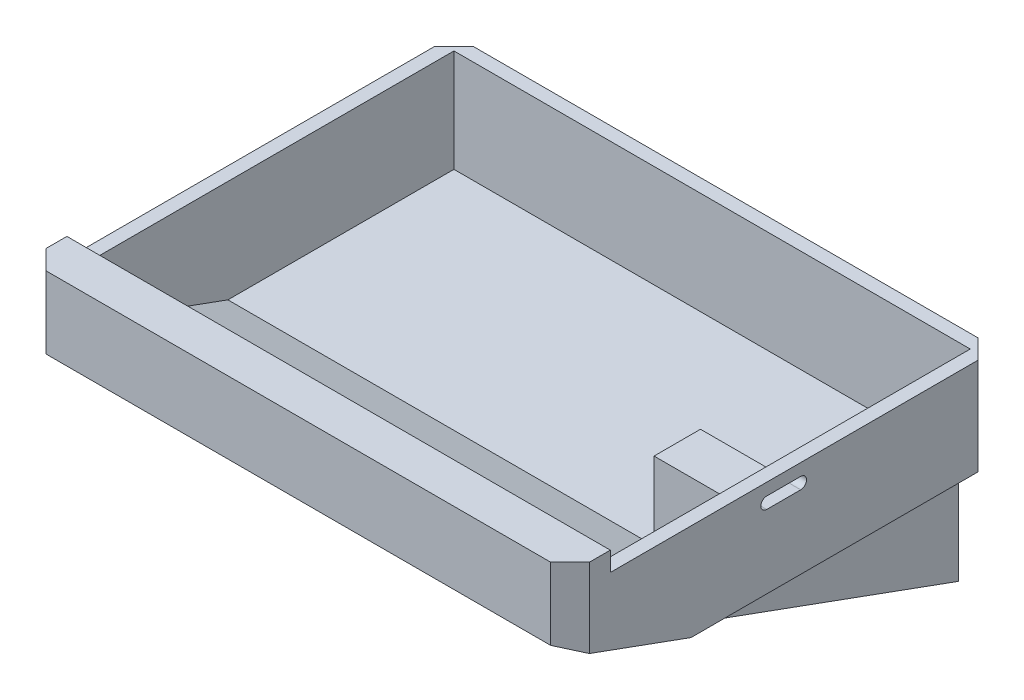
ISO-10303-21;
HEADER;
FILE_DESCRIPTION(('STEP AP214'),'2;1');
FILE_NAME('part.step','',(''),(''),'','','');
FILE_SCHEMA(('AUTOMOTIVE_DESIGN { 1 0 10303 214 1 1 1 1 }'));
ENDSEC;
DATA;
#1=APPLICATION_CONTEXT('core data for automotive mechanical design processes');
#2=APPLICATION_PROTOCOL_DEFINITION('international standard','automotive_design',2000,#1);
#3=PRODUCT_CONTEXT('',#1,'mechanical');
#4=PRODUCT('Part','Part','',(#3));
#5=PRODUCT_RELATED_PRODUCT_CATEGORY('part','',(#4));
#6=PRODUCT_DEFINITION_FORMATION('','',#4);
#7=PRODUCT_DEFINITION_CONTEXT('part definition',#1,'design');
#8=PRODUCT_DEFINITION('design','',#6,#7);
#9=PRODUCT_DEFINITION_SHAPE('','',#8);
#10=(LENGTH_UNIT() NAMED_UNIT(*) SI_UNIT(.MILLI.,.METRE.));
#11=(NAMED_UNIT(*) PLANE_ANGLE_UNIT() SI_UNIT($,.RADIAN.));
#12=(NAMED_UNIT(*) SI_UNIT($,.STERADIAN.) SOLID_ANGLE_UNIT());
#13=UNCERTAINTY_MEASURE_WITH_UNIT(LENGTH_MEASURE(1.E-05),#10,'distance_accuracy_value','');
#14=(GEOMETRIC_REPRESENTATION_CONTEXT(3) GLOBAL_UNCERTAINTY_ASSIGNED_CONTEXT((#13)) GLOBAL_UNIT_ASSIGNED_CONTEXT((#10,
#11,#12)) REPRESENTATION_CONTEXT('',''));
#15=CARTESIAN_POINT('',(0.,0.,0.));
#16=DIRECTION('',(0.,0.,1.));
#17=DIRECTION('',(1.,0.,0.));
#18=AXIS2_PLACEMENT_3D('',#15,#16,#17);
#19=CARTESIAN_POINT('',(0.,-30.,0.));
#20=DIRECTION('',(0.,-1.,0.));
#21=DIRECTION('',(0.,0.,-1.));
#22=AXIS2_PLACEMENT_3D('',#19,#20,#21);
#23=PLANE('',#22);
#24=DIRECTION('',(-1.,0.,0.));
#25=VECTOR('',#24,1.);
#26=CARTESIAN_POINT('',(0.,-30.,10.1999999999996));
#27=LINE('',#26,#25);
#28=CARTESIAN_POINT('',(60.2,-30.,10.1999999999996));
#29=VERTEX_POINT('',#28);
#30=CARTESIAN_POINT('',(-60.2,-30.,10.1999999999996));
#31=VERTEX_POINT('',#30);
#32=EDGE_CURVE('E66',#29,#31,#27,.T.);
#33=ORIENTED_EDGE('',*,*,#32,.T.);
#34=DIRECTION('',(0.,0.,1.));
#35=VECTOR('',#34,1.);
#36=CARTESIAN_POINT('',(-60.2,-30.,-50.2000000000001));
#37=LINE('',#36,#35);
#38=CARTESIAN_POINT('',(-60.2,-30.,-50.2000000000001));
#39=VERTEX_POINT('',#38);
#40=EDGE_CURVE('E262',#39,#31,#37,.T.);
#41=ORIENTED_EDGE('',*,*,#40,.F.);
#42=DIRECTION('',(1.,0.,0.));
#43=VECTOR('',#42,1.);
#44=CARTESIAN_POINT('',(0.,-30.,-50.2000000000001));
#45=LINE('',#44,#43);
#46=CARTESIAN_POINT('',(60.2,-30.,-50.2000000000001));
#47=VERTEX_POINT('',#46);
#48=EDGE_CURVE('E550',#39,#47,#45,.T.);
#49=ORIENTED_EDGE('',*,*,#48,.T.);
#50=DIRECTION('',(0.,0.,1.));
#51=VECTOR('',#50,1.);
#52=CARTESIAN_POINT('',(60.2,-30.,-50.2000000000001));
#53=LINE('',#52,#51);
#54=EDGE_CURVE('E295',#47,#29,#53,.T.);
#55=ORIENTED_EDGE('',*,*,#54,.T.);
#56=EDGE_LOOP('',(#33,#41,#49,#55));
#57=FACE_BOUND('',#56,.T.);
#58=ADVANCED_FACE('F47',(#57),#23,.T.);
#59=CARTESIAN_POINT('',(66.7,-30.,55.2));
#60=DIRECTION('',(1.,0.,0.));
#61=DIRECTION('',(0.,0.,-1.));
#62=AXIS2_PLACEMENT_3D('',#59,#60,#61);
#63=PLANE('',#62);
#64=DIRECTION('',(0.,0.,1.));
#65=VECTOR('',#64,1.);
#66=CARTESIAN_POINT('',(66.7,-6.1,-4.4));
#67=LINE('',#66,#65);
#68=CARTESIAN_POINT('',(66.7,-6.1,-4.4));
#69=VERTEX_POINT('',#68);
#70=CARTESIAN_POINT('',(66.7,-6.1,4.4));
#71=VERTEX_POINT('',#70);
#72=EDGE_CURVE('E358',#69,#71,#67,.T.);
#73=ORIENTED_EDGE('',*,*,#72,.F.);
#74=CARTESIAN_POINT('',(66.7,-4.6,-4.4));
#75=DIRECTION('',(-1.,0.,0.));
#76=DIRECTION('',(0.,0.,1.));
#77=AXIS2_PLACEMENT_3D('',#74,#75,#76);
#78=CIRCLE('',#77,1.5);
#79=CARTESIAN_POINT('',(66.7,-3.1,-4.4));
#80=VERTEX_POINT('',#79);
#81=EDGE_CURVE('E355',#80,#69,#78,.T.);
#82=ORIENTED_EDGE('',*,*,#81,.F.);
#83=DIRECTION('',(0.,0.,-1.));
#84=VECTOR('',#83,1.);
#85=CARTESIAN_POINT('',(66.7,-3.1,-4.4));
#86=LINE('',#85,#84);
#87=CARTESIAN_POINT('',(66.7,-3.1,4.4));
#88=VERTEX_POINT('',#87);
#89=EDGE_CURVE('E366',#88,#80,#86,.T.);
#90=ORIENTED_EDGE('',*,*,#89,.F.);
#91=CARTESIAN_POINT('',(66.7,-4.6,4.4));
#92=DIRECTION('',(-1.,0.,0.));
#93=DIRECTION('',(0.,0.,1.));
#94=AXIS2_PLACEMENT_3D('',#91,#92,#93);
#95=CIRCLE('',#94,1.5);
#96=EDGE_CURVE('E362',#71,#88,#95,.T.);
#97=ORIENTED_EDGE('',*,*,#96,.F.);
#98=EDGE_LOOP('',(#73,#82,#90,#97));
#99=FACE_BOUND('',#98,.T.);
#100=DIRECTION('',(0.,0.,-1.));
#101=VECTOR('',#100,1.);
#102=CARTESIAN_POINT('',(66.7,-26.5,55.2));
#103=LINE('',#102,#101);
#104=CARTESIAN_POINT('',(66.7,-26.5,6.70000000000046));
#105=VERTEX_POINT('',#104);
#106=CARTESIAN_POINT('',(66.7,-26.5,6.));
#107=VERTEX_POINT('',#106);
#108=EDGE_CURVE('E430',#105,#107,#103,.T.);
#109=ORIENTED_EDGE('',*,*,#108,.F.);
#110=DIRECTION('',(0.,-0.342020143325673,-0.939692620785907));
#111=VECTOR('',#110,1.);
#112=CARTESIAN_POINT('',(66.7,-26.5,6.70000000000046));
#113=LINE('',#112,#111);
#114=CARTESIAN_POINT('',(66.7,-10.1213394580209,51.7));
#115=VERTEX_POINT('',#114);
#116=EDGE_CURVE('E482',#105,#115,#113,.F.);
#117=ORIENTED_EDGE('',*,*,#116,.T.);
#118=DIRECTION('',(0.,1.,0.));
#119=VECTOR('',#118,1.);
#120=CARTESIAN_POINT('',(66.7,-30.,51.7));
#121=LINE('',#120,#119);
#122=CARTESIAN_POINT('',(66.7,0.,51.7));
#123=VERTEX_POINT('',#122);
#124=EDGE_CURVE('E425',#115,#123,#121,.T.);
#125=ORIENTED_EDGE('',*,*,#124,.T.);
#126=DIRECTION('',(0.,0.,-1.));
#127=VECTOR('',#126,1.);
#128=CARTESIAN_POINT('',(66.7,0.,55.2));
#129=LINE('',#128,#127);
#130=CARTESIAN_POINT('',(66.7,0.,44.8));
#131=VERTEX_POINT('',#130);
#132=EDGE_CURVE('E451',#123,#131,#129,.T.);
#133=ORIENTED_EDGE('',*,*,#132,.T.);
#134=CARTESIAN_POINT('',(66.7,0.,-51.7));
#135=VERTEX_POINT('',#134);
#136=EDGE_CURVE('E424',#131,#135,#129,.T.);
#137=ORIENTED_EDGE('',*,*,#136,.T.);
#138=DIRECTION('',(0.,1.,0.));
#139=VECTOR('',#138,1.);
#140=CARTESIAN_POINT('',(66.7,-30.,-51.7));
#141=LINE('',#140,#139);
#142=CARTESIAN_POINT('',(66.7,-26.5,-51.7));
#143=VERTEX_POINT('',#142);
#144=EDGE_CURVE('E435',#143,#135,#141,.T.);
#145=ORIENTED_EDGE('',*,*,#144,.F.);
#146=CARTESIAN_POINT('',(66.7,-26.5,-6.));
#147=VERTEX_POINT('',#146);
#148=EDGE_CURVE('E434',#147,#143,#103,.T.);
#149=ORIENTED_EDGE('',*,*,#148,.F.);
#150=DIRECTION('',(0.,-1.,0.));
#151=VECTOR('',#150,1.);
#152=CARTESIAN_POINT('',(66.7,-26.5,-6.));
#153=LINE('',#152,#151);
#154=CARTESIAN_POINT('',(66.7,-7.1,-6.));
#155=VERTEX_POINT('',#154);
#156=EDGE_CURVE('E330',#155,#147,#153,.T.);
#157=ORIENTED_EDGE('',*,*,#156,.F.);
#158=DIRECTION('',(0.,0.,-1.));
#159=VECTOR('',#158,1.);
#160=CARTESIAN_POINT('',(66.7,-7.1,-6.));
#161=LINE('',#160,#159);
#162=CARTESIAN_POINT('',(66.7,-7.1,6.));
#163=VERTEX_POINT('',#162);
#164=EDGE_CURVE('E319',#163,#155,#161,.T.);
#165=ORIENTED_EDGE('',*,*,#164,.F.);
#166=DIRECTION('',(0.,1.,0.));
#167=VECTOR('',#166,1.);
#168=CARTESIAN_POINT('',(66.7,-26.5,6.));
#169=LINE('',#168,#167);
#170=EDGE_CURVE('E334',#107,#163,#169,.T.);
#171=ORIENTED_EDGE('',*,*,#170,.F.);
#172=EDGE_LOOP('',(#109,#117,#125,#133,#137,#145,#149,#157,#165,#171));
#173=FACE_BOUND('',#172,.T.);
#174=ADVANCED_FACE('F685',(#99,#173),#63,.F.);
#175=CARTESIAN_POINT('',(0.,-26.5,0.));
#176=DIRECTION('',(0.,-1.,0.));
#177=DIRECTION('',(0.,0.,-1.));
#178=AXIS2_PLACEMENT_3D('',#175,#176,#177);
#179=PLANE('',#178);
#180=DIRECTION('',(0.,0.,1.));
#181=VECTOR('',#180,1.);
#182=CARTESIAN_POINT('',(-66.7,-26.5,55.2));
#183=LINE('',#182,#181);
#184=CARTESIAN_POINT('',(-66.7,-26.5,-51.7));
#185=VERTEX_POINT('',#184);
#186=CARTESIAN_POINT('',(-66.7,-26.5,6.70000000000046));
#187=VERTEX_POINT('',#186);
#188=EDGE_CURVE('E440',#185,#187,#183,.T.);
#189=ORIENTED_EDGE('',*,*,#188,.T.);
#190=DIRECTION('',(1.,0.,0.));
#191=VECTOR('',#190,1.);
#192=CARTESIAN_POINT('',(66.7,-26.5,6.70000000000046));
#193=LINE('',#192,#191);
#194=EDGE_CURVE('E478',#187,#105,#193,.T.);
#195=ORIENTED_EDGE('',*,*,#194,.T.);
#196=ORIENTED_EDGE('',*,*,#108,.T.);
#197=DIRECTION('',(1.,0.,0.));
#198=VECTOR('',#197,1.);
#199=CARTESIAN_POINT('',(42.7,-26.5,6.));
#200=LINE('',#199,#198);
#201=CARTESIAN_POINT('',(42.7,-26.5,6.));
#202=VERTEX_POINT('',#201);
#203=EDGE_CURVE('E348',#202,#107,#200,.T.);
#204=ORIENTED_EDGE('',*,*,#203,.F.);
#205=DIRECTION('',(0.,0.,1.));
#206=VECTOR('',#205,1.);
#207=CARTESIAN_POINT('',(42.7,-26.5,-6.));
#208=LINE('',#207,#206);
#209=CARTESIAN_POINT('',(42.7,-26.5,-6.));
#210=VERTEX_POINT('',#209);
#211=EDGE_CURVE('E318',#210,#202,#208,.T.);
#212=ORIENTED_EDGE('',*,*,#211,.F.);
#213=DIRECTION('',(1.,0.,0.));
#214=VECTOR('',#213,1.);
#215=CARTESIAN_POINT('',(42.7,-26.5,-6.));
#216=LINE('',#215,#214);
#217=EDGE_CURVE('E352',#210,#147,#216,.T.);
#218=ORIENTED_EDGE('',*,*,#217,.T.);
#219=ORIENTED_EDGE('',*,*,#148,.T.);
#220=DIRECTION('',(-1.,0.,0.));
#221=VECTOR('',#220,1.);
#222=CARTESIAN_POINT('',(-70.2,-26.5,-51.7));
#223=LINE('',#222,#221);
#224=EDGE_CURVE('E433',#143,#185,#223,.T.);
#225=ORIENTED_EDGE('',*,*,#224,.T.);
#226=EDGE_LOOP('',(#189,#195,#196,#204,#212,#218,#219,#225));
#227=FACE_BOUND('',#226,.T.);
#228=ADVANCED_FACE('F694',(#227),#179,.F.);
#229=CARTESIAN_POINT('',(0.,0.,0.));
#230=DIRECTION('',(0.,-1.,0.));
#231=DIRECTION('',(0.,0.,-1.));
#232=AXIS2_PLACEMENT_3D('',#229,#230,#231);
#233=PLANE('',#232);
#234=DIRECTION('',(-1.,0.,0.));
#235=VECTOR('',#234,1.);
#236=CARTESIAN_POINT('',(-70.2,0.,-55.2));
#237=LINE('',#236,#235);
#238=CARTESIAN_POINT('',(65.2,0.,-55.2));
#239=VERTEX_POINT('',#238);
#240=CARTESIAN_POINT('',(-65.2,0.,-55.2));
#241=VERTEX_POINT('',#240);
#242=EDGE_CURVE('E471',#239,#241,#237,.T.);
#243=ORIENTED_EDGE('',*,*,#242,.T.);
#244=DIRECTION('',(0.707106781186549,0.,-0.707106781186546));
#245=VECTOR('',#244,1.);
#246=CARTESIAN_POINT('',(-65.2,0.,-55.2));
#247=LINE('',#246,#245);
#248=CARTESIAN_POINT('',(-70.2,0.,-50.2));
#249=VERTEX_POINT('',#248);
#250=EDGE_CURVE('E11',#241,#249,#247,.F.);
#251=ORIENTED_EDGE('',*,*,#250,.T.);
#252=DIRECTION('',(0.,0.,1.));
#253=VECTOR('',#252,1.);
#254=CARTESIAN_POINT('',(-70.2,0.,55.2));
#255=LINE('',#254,#253);
#256=CARTESIAN_POINT('',(-70.2,0.,44.8));
#257=VERTEX_POINT('',#256);
#258=EDGE_CURVE('E475',#249,#257,#255,.T.);
#259=ORIENTED_EDGE('',*,*,#258,.T.);
#260=DIRECTION('',(-1.,0.,0.));
#261=VECTOR('',#260,1.);
#262=CARTESIAN_POINT('',(-70.2,0.,44.8));
#263=LINE('',#262,#261);
#264=CARTESIAN_POINT('',(-66.7,0.,44.8));
#265=VERTEX_POINT('',#264);
#266=EDGE_CURVE('E416',#265,#257,#263,.T.);
#267=ORIENTED_EDGE('',*,*,#266,.F.);
#268=DIRECTION('',(0.,0.,1.));
#269=VECTOR('',#268,1.);
#270=CARTESIAN_POINT('',(-66.7,0.,55.2));
#271=LINE('',#270,#269);
#272=CARTESIAN_POINT('',(-66.7,0.,-51.7));
#273=VERTEX_POINT('',#272);
#274=EDGE_CURVE('E460',#273,#265,#271,.T.);
#275=ORIENTED_EDGE('',*,*,#274,.F.);
#276=DIRECTION('',(-1.,0.,0.));
#277=VECTOR('',#276,1.);
#278=CARTESIAN_POINT('',(-70.2,0.,-51.7));
#279=LINE('',#278,#277);
#280=EDGE_CURVE('E455',#135,#273,#279,.T.);
#281=ORIENTED_EDGE('',*,*,#280,.F.);
#282=ORIENTED_EDGE('',*,*,#136,.F.);
#283=CARTESIAN_POINT('',(70.2,0.,44.8));
#284=VERTEX_POINT('',#283);
#285=EDGE_CURVE('E402',#284,#131,#263,.T.);
#286=ORIENTED_EDGE('',*,*,#285,.F.);
#287=DIRECTION('',(0.,0.,-1.));
#288=VECTOR('',#287,1.);
#289=CARTESIAN_POINT('',(70.2,0.,55.2));
#290=LINE('',#289,#288);
#291=CARTESIAN_POINT('',(70.2,0.,-50.2));
#292=VERTEX_POINT('',#291);
#293=EDGE_CURVE('E428',#284,#292,#290,.T.);
#294=ORIENTED_EDGE('',*,*,#293,.T.);
#295=DIRECTION('',(0.707106781186549,0.,0.707106781186546));
#296=VECTOR('',#295,1.);
#297=CARTESIAN_POINT('',(70.2,0.,-50.2000000000001));
#298=LINE('',#297,#296);
#299=EDGE_CURVE('E58',#292,#239,#298,.F.);
#300=ORIENTED_EDGE('',*,*,#299,.T.);
#301=EDGE_LOOP('',(#243,#251,#259,#267,#275,#281,#282,#286,#294,#300));
#302=FACE_BOUND('',#301,.T.);
#303=ADVANCED_FACE('F633',(#302),#233,.F.);
#304=CARTESIAN_POINT('',(70.2,-30.,55.2));
#305=DIRECTION('',(1.,0.,0.));
#306=DIRECTION('',(0.,0.,-1.));
#307=AXIS2_PLACEMENT_3D('',#304,#305,#306);
#308=PLANE('',#307);
#309=CARTESIAN_POINT('',(70.2,-4.6,-4.4));
#310=DIRECTION('',(1.,0.,0.));
#311=DIRECTION('',(0.,0.,-1.));
#312=AXIS2_PLACEMENT_3D('',#309,#310,#311);
#313=CIRCLE('',#312,1.5);
#314=CARTESIAN_POINT('',(70.2,-6.1,-4.4));
#315=VERTEX_POINT('',#314);
#316=CARTESIAN_POINT('',(70.2,-3.1,-4.4));
#317=VERTEX_POINT('',#316);
#318=EDGE_CURVE('E393',#315,#317,#313,.T.);
#319=ORIENTED_EDGE('',*,*,#318,.F.);
#320=DIRECTION('',(0.,0.,-1.));
#321=VECTOR('',#320,1.);
#322=CARTESIAN_POINT('',(70.2,-6.1,55.2));
#323=LINE('',#322,#321);
#324=CARTESIAN_POINT('',(70.2,-6.1,4.4));
#325=VERTEX_POINT('',#324);
#326=EDGE_CURVE('E374',#325,#315,#323,.T.);
#327=ORIENTED_EDGE('',*,*,#326,.F.);
#328=CARTESIAN_POINT('',(70.2,-4.6,4.4));
#329=DIRECTION('',(1.,0.,0.));
#330=DIRECTION('',(0.,0.,-1.));
#331=AXIS2_PLACEMENT_3D('',#328,#329,#330);
#332=CIRCLE('',#331,1.5);
#333=CARTESIAN_POINT('',(70.2,-3.1,4.4));
#334=VERTEX_POINT('',#333);
#335=EDGE_CURVE('E386',#334,#325,#332,.T.);
#336=ORIENTED_EDGE('',*,*,#335,.F.);
#337=DIRECTION('',(0.,0.,1.));
#338=VECTOR('',#337,1.);
#339=CARTESIAN_POINT('',(70.2,-3.1,55.2));
#340=LINE('',#339,#338);
#341=EDGE_CURVE('E390',#317,#334,#340,.T.);
#342=ORIENTED_EDGE('',*,*,#341,.F.);
#343=EDGE_LOOP('',(#319,#327,#336,#342));
#344=FACE_BOUND('',#343,.T.);
#345=DIRECTION('',(0.,0.342020143325666,0.939692620785909));
#346=VECTOR('',#345,1.);
#347=CARTESIAN_POINT('',(70.2,-15.5372787820528,49.935999970177));
#348=LINE('',#347,#346);
#349=CARTESIAN_POINT('',(70.2,-15.4411906293519,50.2));
#350=VERTEX_POINT('',#349);
#351=CARTESIAN_POINT('',(70.2,-25.,23.9373870972727));
#352=VERTEX_POINT('',#351);
#353=EDGE_CURVE('E495',#350,#352,#348,.F.);
#354=ORIENTED_EDGE('',*,*,#353,.T.);
#355=DIRECTION('',(0.,0.,-1.));
#356=VECTOR('',#355,1.);
#357=CARTESIAN_POINT('',(70.2,-25.,55.2));
#358=LINE('',#357,#356);
#359=CARTESIAN_POINT('',(70.2,-25.,-50.2000000000001));
#360=VERTEX_POINT('',#359);
#361=EDGE_CURVE('E546',#352,#360,#358,.T.);
#362=ORIENTED_EDGE('',*,*,#361,.T.);
#363=DIRECTION('',(0.,1.,0.));
#364=VECTOR('',#363,1.);
#365=CARTESIAN_POINT('',(70.2,-30.,-50.2000000000001));
#366=LINE('',#365,#364);
#367=EDGE_CURVE('E543',#360,#292,#366,.T.);
#368=ORIENTED_EDGE('',*,*,#367,.T.);
#369=ORIENTED_EDGE('',*,*,#293,.F.);
#370=DIRECTION('',(0.,-1.,0.));
#371=VECTOR('',#370,1.);
#372=CARTESIAN_POINT('',(70.2,5.,44.8));
#373=LINE('',#372,#371);
#374=CARTESIAN_POINT('',(70.2,5.,44.8));
#375=VERTEX_POINT('',#374);
#376=EDGE_CURVE('E420',#375,#284,#373,.T.);
#377=ORIENTED_EDGE('',*,*,#376,.F.);
#378=DIRECTION('',(0.,0.,-1.));
#379=VECTOR('',#378,1.);
#380=CARTESIAN_POINT('',(70.2,5.,55.2));
#381=LINE('',#380,#379);
#382=CARTESIAN_POINT('',(70.2,5.,50.2));
#383=VERTEX_POINT('',#382);
#384=EDGE_CURVE('E406',#383,#375,#381,.T.);
#385=ORIENTED_EDGE('',*,*,#384,.F.);
#386=DIRECTION('',(0.,-1.,0.));
#387=VECTOR('',#386,1.);
#388=CARTESIAN_POINT('',(70.2,-30.,50.2));
#389=LINE('',#388,#387);
#390=EDGE_CURVE('E540',#383,#350,#389,.T.);
#391=ORIENTED_EDGE('',*,*,#390,.T.);
#392=EDGE_LOOP('',(#354,#362,#368,#369,#377,#385,#391));
#393=FACE_BOUND('',#392,.T.);
#394=ADVANCED_FACE('F733',(#344,#393),#308,.T.);
#395=CARTESIAN_POINT('',(-70.2,-30.,55.2));
#396=DIRECTION('',(0.,0.,1.));
#397=DIRECTION('',(1.,0.,0.));
#398=AXIS2_PLACEMENT_3D('',#395,#396,#397);
#399=PLANE('',#398);
#400=DIRECTION('',(1.,0.,0.));
#401=VECTOR('',#400,1.);
#402=CARTESIAN_POINT('',(-70.2,5.,55.2));
#403=LINE('',#402,#401);
#404=CARTESIAN_POINT('',(-65.2,5.,55.2));
#405=VERTEX_POINT('',#404);
#406=CARTESIAN_POINT('',(65.2,5.,55.2));
#407=VERTEX_POINT('',#406);
#408=EDGE_CURVE('E401',#405,#407,#403,.T.);
#409=ORIENTED_EDGE('',*,*,#408,.F.);
#410=DIRECTION('',(0.,-1.,0.));
#411=VECTOR('',#410,1.);
#412=CARTESIAN_POINT('',(-65.2,-30.,55.2));
#413=LINE('',#412,#411);
#414=CARTESIAN_POINT('',(-65.2,-13.6213394580209,55.2));
#415=VERTEX_POINT('',#414);
#416=EDGE_CURVE('E525',#405,#415,#413,.T.);
#417=ORIENTED_EDGE('',*,*,#416,.T.);
#418=DIRECTION('',(1.,0.,0.));
#419=VECTOR('',#418,1.);
#420=CARTESIAN_POINT('',(-70.2,-13.6213394580209,55.2));
#421=LINE('',#420,#419);
#422=CARTESIAN_POINT('',(65.2,-13.6213394580209,55.2));
#423=VERTEX_POINT('',#422);
#424=EDGE_CURVE('E491',#415,#423,#421,.T.);
#425=ORIENTED_EDGE('',*,*,#424,.T.);
#426=DIRECTION('',(0.,1.,0.));
#427=VECTOR('',#426,1.);
#428=CARTESIAN_POINT('',(65.2,-30.,55.2));
#429=LINE('',#428,#427);
#430=EDGE_CURVE('E521',#423,#407,#429,.T.);
#431=ORIENTED_EDGE('',*,*,#430,.T.);
#432=EDGE_LOOP('',(#409,#417,#425,#431));
#433=FACE_BOUND('',#432,.T.);
#434=ADVANCED_FACE('F734',(#433),#399,.T.);
#435=CARTESIAN_POINT('',(-70.2,-30.,55.2));
#436=DIRECTION('',(-1.,0.,0.));
#437=DIRECTION('',(0.,0.,1.));
#438=AXIS2_PLACEMENT_3D('',#435,#436,#437);
#439=PLANE('',#438);
#440=DIRECTION('',(0.,-0.342020143325666,-0.939692620785909));
#441=VECTOR('',#440,1.);
#442=CARTESIAN_POINT('',(-70.2,-15.5372787820528,49.935999970177));
#443=LINE('',#442,#441);
#444=CARTESIAN_POINT('',(-70.2,-25.,23.9373870972727));
#445=VERTEX_POINT('',#444);
#446=CARTESIAN_POINT('',(-70.2,-15.4411906293519,50.2000000000001));
#447=VERTEX_POINT('',#446);
#448=EDGE_CURVE('E501',#445,#447,#443,.F.);
#449=ORIENTED_EDGE('',*,*,#448,.T.);
#450=DIRECTION('',(0.,1.,0.));
#451=VECTOR('',#450,1.);
#452=CARTESIAN_POINT('',(-70.2,-30.,50.2000000000001));
#453=LINE('',#452,#451);
#454=CARTESIAN_POINT('',(-70.2,5.,50.2000000000001));
#455=VERTEX_POINT('',#454);
#456=EDGE_CURVE('E511',#447,#455,#453,.T.);
#457=ORIENTED_EDGE('',*,*,#456,.T.);
#458=DIRECTION('',(0.,0.,1.));
#459=VECTOR('',#458,1.);
#460=CARTESIAN_POINT('',(-70.2,5.,55.2));
#461=LINE('',#460,#459);
#462=CARTESIAN_POINT('',(-70.2,5.,44.8));
#463=VERTEX_POINT('',#462);
#464=EDGE_CURVE('E397',#463,#455,#461,.T.);
#465=ORIENTED_EDGE('',*,*,#464,.F.);
#466=DIRECTION('',(0.,-1.,0.));
#467=VECTOR('',#466,1.);
#468=CARTESIAN_POINT('',(-70.2,5.,44.8));
#469=LINE('',#468,#467);
#470=EDGE_CURVE('E412',#463,#257,#469,.T.);
#471=ORIENTED_EDGE('',*,*,#470,.T.);
#472=ORIENTED_EDGE('',*,*,#258,.F.);
#473=DIRECTION('',(0.,-1.,0.));
#474=VECTOR('',#473,1.);
#475=CARTESIAN_POINT('',(-70.2,-30.,-50.2000000000001));
#476=LINE('',#475,#474);
#477=CARTESIAN_POINT('',(-70.2,-25.,-50.2000000000001));
#478=VERTEX_POINT('',#477);
#479=EDGE_CURVE('E505',#249,#478,#476,.T.);
#480=ORIENTED_EDGE('',*,*,#479,.T.);
#481=DIRECTION('',(0.,0.,1.));
#482=VECTOR('',#481,1.);
#483=CARTESIAN_POINT('',(-70.2,-25.,55.2));
#484=LINE('',#483,#482);
#485=EDGE_CURVE('E508',#478,#445,#484,.T.);
#486=ORIENTED_EDGE('',*,*,#485,.T.);
#487=EDGE_LOOP('',(#449,#457,#465,#471,#472,#480,#486));
#488=FACE_BOUND('',#487,.T.);
#489=ADVANCED_FACE('F611',(#488),#439,.T.);
#490=CARTESIAN_POINT('',(-70.2,-30.,-55.2));
#491=DIRECTION('',(0.,0.,-1.));
#492=DIRECTION('',(-1.,0.,0.));
#493=AXIS2_PLACEMENT_3D('',#490,#491,#492);
#494=PLANE('',#493);
#495=DIRECTION('',(-1.,0.,0.));
#496=VECTOR('',#495,1.);
#497=CARTESIAN_POINT('',(-70.2,-25.,-55.2));
#498=LINE('',#497,#496);
#499=CARTESIAN_POINT('',(65.2,-25.,-55.2));
#500=VERTEX_POINT('',#499);
#501=CARTESIAN_POINT('',(-65.2,-25.,-55.2));
#502=VERTEX_POINT('',#501);
#503=EDGE_CURVE('E563',#500,#502,#498,.T.);
#504=ORIENTED_EDGE('',*,*,#503,.T.);
#505=DIRECTION('',(0.,1.,0.));
#506=VECTOR('',#505,1.);
#507=CARTESIAN_POINT('',(-65.2,-30.,-55.2));
#508=LINE('',#507,#506);
#509=EDGE_CURVE('E566',#502,#241,#508,.T.);
#510=ORIENTED_EDGE('',*,*,#509,.T.);
#511=ORIENTED_EDGE('',*,*,#242,.F.);
#512=DIRECTION('',(0.,-1.,0.));
#513=VECTOR('',#512,1.);
#514=CARTESIAN_POINT('',(65.2,-30.,-55.2));
#515=LINE('',#514,#513);
#516=EDGE_CURVE('E560',#239,#500,#515,.T.);
#517=ORIENTED_EDGE('',*,*,#516,.T.);
#518=EDGE_LOOP('',(#504,#510,#511,#517));
#519=FACE_BOUND('',#518,.T.);
#520=ADVANCED_FACE('F638',(#519),#494,.T.);
#521=CARTESIAN_POINT('',(-70.2,-30.,51.7));
#522=DIRECTION('',(0.,0.,1.));
#523=DIRECTION('',(1.,0.,0.));
#524=AXIS2_PLACEMENT_3D('',#521,#522,#523);
#525=PLANE('',#524);
#526=ORIENTED_EDGE('',*,*,#124,.F.);
#527=DIRECTION('',(-1.,0.,0.));
#528=VECTOR('',#527,1.);
#529=CARTESIAN_POINT('',(-66.7,-10.1213394580209,51.7));
#530=LINE('',#529,#528);
#531=CARTESIAN_POINT('',(-66.7,-10.1213394580209,51.7));
#532=VERTEX_POINT('',#531);
#533=EDGE_CURVE('E485',#115,#532,#530,.T.);
#534=ORIENTED_EDGE('',*,*,#533,.T.);
#535=DIRECTION('',(0.,1.,0.));
#536=VECTOR('',#535,1.);
#537=CARTESIAN_POINT('',(-66.7,-30.,51.7));
#538=LINE('',#537,#536);
#539=CARTESIAN_POINT('',(-66.7,0.,51.7));
#540=VERTEX_POINT('',#539);
#541=EDGE_CURVE('E429',#532,#540,#538,.T.);
#542=ORIENTED_EDGE('',*,*,#541,.T.);
#543=DIRECTION('',(1.,0.,0.));
#544=VECTOR('',#543,1.);
#545=CARTESIAN_POINT('',(-70.2,0.,51.7));
#546=LINE('',#545,#544);
#547=EDGE_CURVE('E464',#540,#123,#546,.T.);
#548=ORIENTED_EDGE('',*,*,#547,.T.);
#549=EDGE_LOOP('',(#526,#534,#542,#548));
#550=FACE_BOUND('',#549,.T.);
#551=ADVANCED_FACE('F689',(#550),#525,.F.);
#552=CARTESIAN_POINT('',(-66.7,-30.,55.2));
#553=DIRECTION('',(-1.,0.,0.));
#554=DIRECTION('',(0.,0.,1.));
#555=AXIS2_PLACEMENT_3D('',#552,#553,#554);
#556=PLANE('',#555);
#557=ORIENTED_EDGE('',*,*,#541,.F.);
#558=DIRECTION('',(0.,0.342020143325673,0.939692620785907));
#559=VECTOR('',#558,1.);
#560=CARTESIAN_POINT('',(-66.7,-26.5,6.70000000000046));
#561=LINE('',#560,#559);
#562=EDGE_CURVE('E488',#532,#187,#561,.F.);
#563=ORIENTED_EDGE('',*,*,#562,.T.);
#564=ORIENTED_EDGE('',*,*,#188,.F.);
#565=DIRECTION('',(0.,1.,0.));
#566=VECTOR('',#565,1.);
#567=CARTESIAN_POINT('',(-66.7,-30.,-51.7));
#568=LINE('',#567,#566);
#569=EDGE_CURVE('E439',#185,#273,#568,.T.);
#570=ORIENTED_EDGE('',*,*,#569,.T.);
#571=ORIENTED_EDGE('',*,*,#274,.T.);
#572=EDGE_CURVE('E459',#265,#540,#271,.T.);
#573=ORIENTED_EDGE('',*,*,#572,.T.);
#574=EDGE_LOOP('',(#557,#563,#564,#570,#571,#573));
#575=FACE_BOUND('',#574,.T.);
#576=ADVANCED_FACE('F673',(#575),#556,.F.);
#577=CARTESIAN_POINT('',(-70.2,-30.,-51.7));
#578=DIRECTION('',(0.,0.,-1.));
#579=DIRECTION('',(-1.,0.,0.));
#580=AXIS2_PLACEMENT_3D('',#577,#578,#579);
#581=PLANE('',#580);
#582=ORIENTED_EDGE('',*,*,#280,.T.);
#583=ORIENTED_EDGE('',*,*,#569,.F.);
#584=ORIENTED_EDGE('',*,*,#224,.F.);
#585=ORIENTED_EDGE('',*,*,#144,.T.);
#586=EDGE_LOOP('',(#582,#583,#584,#585));
#587=FACE_BOUND('',#586,.T.);
#588=ADVANCED_FACE('F679',(#587),#581,.F.);
#589=CARTESIAN_POINT('',(0.,0.,0.));
#590=DIRECTION('',(0.,-1.,0.));
#591=DIRECTION('',(0.,0.,-1.));
#592=AXIS2_PLACEMENT_3D('',#589,#590,#591);
#593=PLANE('',#592);
#594=ORIENTED_EDGE('',*,*,#132,.F.);
#595=ORIENTED_EDGE('',*,*,#547,.F.);
#596=ORIENTED_EDGE('',*,*,#572,.F.);
#597=EDGE_CURVE('E396',#131,#265,#263,.T.);
#598=ORIENTED_EDGE('',*,*,#597,.F.);
#599=EDGE_LOOP('',(#594,#595,#596,#598));
#600=FACE_BOUND('',#599,.T.);
#601=ADVANCED_FACE('F669',(#600),#593,.T.);
#602=CARTESIAN_POINT('',(-70.2,5.,44.8));
#603=DIRECTION('',(0.,0.,1.));
#604=DIRECTION('',(1.,0.,0.));
#605=AXIS2_PLACEMENT_3D('',#602,#603,#604);
#606=PLANE('',#605);
#607=ORIENTED_EDGE('',*,*,#285,.T.);
#608=ORIENTED_EDGE('',*,*,#597,.T.);
#609=ORIENTED_EDGE('',*,*,#266,.T.);
#610=ORIENTED_EDGE('',*,*,#470,.F.);
#611=DIRECTION('',(-1.,0.,0.));
#612=VECTOR('',#611,1.);
#613=CARTESIAN_POINT('',(-70.2,5.,44.8));
#614=LINE('',#613,#612);
#615=EDGE_CURVE('E409',#375,#463,#614,.T.);
#616=ORIENTED_EDGE('',*,*,#615,.F.);
#617=ORIENTED_EDGE('',*,*,#376,.T.);
#618=EDGE_LOOP('',(#607,#608,#609,#610,#616,#617));
#619=FACE_BOUND('',#618,.T.);
#620=ADVANCED_FACE('F628',(#619),#606,.F.);
#621=CARTESIAN_POINT('',(0.,5.,0.));
#622=DIRECTION('',(0.,-1.,0.));
#623=DIRECTION('',(0.,0.,-1.));
#624=AXIS2_PLACEMENT_3D('',#621,#622,#623);
#625=PLANE('',#624);
#626=ORIENTED_EDGE('',*,*,#464,.T.);
#627=DIRECTION('',(-0.707106781186549,0.,-0.707106781186546));
#628=VECTOR('',#627,1.);
#629=CARTESIAN_POINT('',(-70.2,5.,50.2000000000001));
#630=LINE('',#629,#628);
#631=EDGE_CURVE('E518',#455,#405,#630,.F.);
#632=ORIENTED_EDGE('',*,*,#631,.T.);
#633=ORIENTED_EDGE('',*,*,#408,.T.);
#634=DIRECTION('',(-0.707106781186546,0.,0.707106781186549));
#635=VECTOR('',#634,1.);
#636=CARTESIAN_POINT('',(65.2,5.,55.2));
#637=LINE('',#636,#635);
#638=EDGE_CURVE('E515',#407,#383,#637,.F.);
#639=ORIENTED_EDGE('',*,*,#638,.T.);
#640=ORIENTED_EDGE('',*,*,#384,.T.);
#641=ORIENTED_EDGE('',*,*,#615,.T.);
#642=EDGE_LOOP('',(#626,#632,#633,#639,#640,#641));
#643=FACE_BOUND('',#642,.T.);
#644=ADVANCED_FACE('F620',(#643),#625,.F.);
#645=CARTESIAN_POINT('',(71.7,-4.6,-4.4));
#646=DIRECTION('',(-1.,0.,0.));
#647=DIRECTION('',(0.,0.,1.));
#648=AXIS2_PLACEMENT_3D('',#645,#646,#647);
#649=CYLINDRICAL_SURFACE('',#648,1.5);
#650=ORIENTED_EDGE('',*,*,#318,.T.);
#651=DIRECTION('',(-1.,0.,0.));
#652=VECTOR('',#651,1.);
#653=CARTESIAN_POINT('',(71.7,-3.1,-4.4));
#654=LINE('',#653,#652);
#655=EDGE_CURVE('E371',#317,#80,#654,.T.);
#656=ORIENTED_EDGE('',*,*,#655,.T.);
#657=ORIENTED_EDGE('',*,*,#81,.T.);
#658=DIRECTION('',(-1.,0.,0.));
#659=VECTOR('',#658,1.);
#660=CARTESIAN_POINT('',(71.7,-6.1,-4.4));
#661=LINE('',#660,#659);
#662=EDGE_CURVE('E370',#315,#69,#661,.T.);
#663=ORIENTED_EDGE('',*,*,#662,.F.);
#664=EDGE_LOOP('',(#650,#656,#657,#663));
#665=FACE_BOUND('',#664,.T.);
#666=ADVANCED_FACE('F975',(#665),#649,.F.);
#667=CARTESIAN_POINT('',(71.7,-3.1,-4.4));
#668=DIRECTION('',(0.,1.,0.));
#669=DIRECTION('',(0.,0.,1.));
#670=AXIS2_PLACEMENT_3D('',#667,#668,#669);
#671=PLANE('',#670);
#672=ORIENTED_EDGE('',*,*,#341,.T.);
#673=DIRECTION('',(-1.,0.,0.));
#674=VECTOR('',#673,1.);
#675=CARTESIAN_POINT('',(71.7,-3.1,4.4));
#676=LINE('',#675,#674);
#677=EDGE_CURVE('E375',#334,#88,#676,.T.);
#678=ORIENTED_EDGE('',*,*,#677,.T.);
#679=ORIENTED_EDGE('',*,*,#89,.T.);
#680=ORIENTED_EDGE('',*,*,#655,.F.);
#681=EDGE_LOOP('',(#672,#678,#679,#680));
#682=FACE_BOUND('',#681,.T.);
#683=ADVANCED_FACE('F966',(#682),#671,.F.);
#684=CARTESIAN_POINT('',(71.7,-4.6,4.4));
#685=DIRECTION('',(-1.,0.,0.));
#686=DIRECTION('',(0.,0.,1.));
#687=AXIS2_PLACEMENT_3D('',#684,#685,#686);
#688=CYLINDRICAL_SURFACE('',#687,1.5);
#689=ORIENTED_EDGE('',*,*,#335,.T.);
#690=DIRECTION('',(-1.,0.,0.));
#691=VECTOR('',#690,1.);
#692=CARTESIAN_POINT('',(71.7,-6.1,4.4));
#693=LINE('',#692,#691);
#694=EDGE_CURVE('E378',#325,#71,#693,.T.);
#695=ORIENTED_EDGE('',*,*,#694,.T.);
#696=ORIENTED_EDGE('',*,*,#96,.T.);
#697=ORIENTED_EDGE('',*,*,#677,.F.);
#698=EDGE_LOOP('',(#689,#695,#696,#697));
#699=FACE_BOUND('',#698,.T.);
#700=ADVANCED_FACE('F957',(#699),#688,.F.);
#701=CARTESIAN_POINT('',(71.7,-6.1,-4.4));
#702=DIRECTION('',(0.,-1.,0.));
#703=DIRECTION('',(0.,0.,-1.));
#704=AXIS2_PLACEMENT_3D('',#701,#702,#703);
#705=PLANE('',#704);
#706=ORIENTED_EDGE('',*,*,#326,.T.);
#707=ORIENTED_EDGE('',*,*,#662,.T.);
#708=ORIENTED_EDGE('',*,*,#72,.T.);
#709=ORIENTED_EDGE('',*,*,#694,.F.);
#710=EDGE_LOOP('',(#706,#707,#708,#709));
#711=FACE_BOUND('',#710,.T.);
#712=ADVANCED_FACE('F935',(#711),#705,.F.);
#713=CARTESIAN_POINT('',(42.7,-26.5,-6.));
#714=DIRECTION('',(0.,0.,1.));
#715=DIRECTION('',(0.,-1.,0.));
#716=AXIS2_PLACEMENT_3D('',#713,#714,#715);
#717=PLANE('',#716);
#718=ORIENTED_EDGE('',*,*,#156,.T.);
#719=ORIENTED_EDGE('',*,*,#217,.F.);
#720=DIRECTION('',(0.,-1.,0.));
#721=VECTOR('',#720,1.);
#722=CARTESIAN_POINT('',(42.7,-26.5,-6.));
#723=LINE('',#722,#721);
#724=CARTESIAN_POINT('',(42.7,-7.1,-6.));
#725=VERTEX_POINT('',#724);
#726=EDGE_CURVE('E314',#725,#210,#723,.T.);
#727=ORIENTED_EDGE('',*,*,#726,.F.);
#728=DIRECTION('',(1.,0.,0.));
#729=VECTOR('',#728,1.);
#730=CARTESIAN_POINT('',(42.7,-7.1,-6.));
#731=LINE('',#730,#729);
#732=EDGE_CURVE('E329',#725,#155,#731,.T.);
#733=ORIENTED_EDGE('',*,*,#732,.T.);
#734=EDGE_LOOP('',(#718,#719,#727,#733));
#735=FACE_BOUND('',#734,.T.);
#736=ADVANCED_FACE('F698',(#735),#717,.F.);
#737=CARTESIAN_POINT('',(42.7,-26.5,6.));
#738=DIRECTION('',(0.,0.,-1.));
#739=DIRECTION('',(0.,1.,0.));
#740=AXIS2_PLACEMENT_3D('',#737,#738,#739);
#741=PLANE('',#740);
#742=ORIENTED_EDGE('',*,*,#170,.T.);
#743=DIRECTION('',(1.,0.,0.));
#744=VECTOR('',#743,1.);
#745=CARTESIAN_POINT('',(42.7,-7.1,6.));
#746=LINE('',#745,#744);
#747=CARTESIAN_POINT('',(42.7,-7.1,6.));
#748=VERTEX_POINT('',#747);
#749=EDGE_CURVE('E344',#748,#163,#746,.T.);
#750=ORIENTED_EDGE('',*,*,#749,.F.);
#751=DIRECTION('',(0.,1.,0.));
#752=VECTOR('',#751,1.);
#753=CARTESIAN_POINT('',(42.7,-26.5,6.));
#754=LINE('',#753,#752);
#755=EDGE_CURVE('E323',#202,#748,#754,.T.);
#756=ORIENTED_EDGE('',*,*,#755,.F.);
#757=ORIENTED_EDGE('',*,*,#203,.T.);
#758=EDGE_LOOP('',(#742,#750,#756,#757));
#759=FACE_BOUND('',#758,.T.);
#760=ADVANCED_FACE('F707',(#759),#741,.F.);
#761=CARTESIAN_POINT('',(42.7,-7.1,-6.));
#762=DIRECTION('',(0.,-1.,0.));
#763=DIRECTION('',(0.,0.,-1.));
#764=AXIS2_PLACEMENT_3D('',#761,#762,#763);
#765=PLANE('',#764);
#766=ORIENTED_EDGE('',*,*,#164,.T.);
#767=ORIENTED_EDGE('',*,*,#732,.F.);
#768=DIRECTION('',(0.,0.,-1.));
#769=VECTOR('',#768,1.);
#770=CARTESIAN_POINT('',(42.7,-7.1,-6.));
#771=LINE('',#770,#769);
#772=EDGE_CURVE('E326',#748,#725,#771,.T.);
#773=ORIENTED_EDGE('',*,*,#772,.F.);
#774=ORIENTED_EDGE('',*,*,#749,.T.);
#775=EDGE_LOOP('',(#766,#767,#773,#774));
#776=FACE_BOUND('',#775,.T.);
#777=ADVANCED_FACE('F702',(#776),#765,.F.);
#778=CARTESIAN_POINT('',(42.7,0.,0.));
#779=DIRECTION('',(1.,0.,0.));
#780=DIRECTION('',(0.,0.,-1.));
#781=AXIS2_PLACEMENT_3D('',#778,#779,#780);
#782=PLANE('',#781);
#783=ORIENTED_EDGE('',*,*,#726,.T.);
#784=ORIENTED_EDGE('',*,*,#211,.T.);
#785=ORIENTED_EDGE('',*,*,#755,.T.);
#786=ORIENTED_EDGE('',*,*,#772,.T.);
#787=EDGE_LOOP('',(#783,#784,#785,#786));
#788=FACE_BOUND('',#787,.T.);
#789=ADVANCED_FACE('F709',(#788),#782,.F.);
#790=CARTESIAN_POINT('',(0.,-26.5,6.70000000000046));
#791=DIRECTION('',(0.,0.939692620785907,-0.342020143325672));
#792=DIRECTION('',(-1.,0.,0.));
#793=AXIS2_PLACEMENT_3D('',#790,#791,#792);
#794=PLANE('',#793);
#795=ORIENTED_EDGE('',*,*,#562,.F.);
#796=ORIENTED_EDGE('',*,*,#533,.F.);
#797=ORIENTED_EDGE('',*,*,#116,.F.);
#798=ORIENTED_EDGE('',*,*,#194,.F.);
#799=EDGE_LOOP('',(#795,#796,#797,#798));
#800=FACE_BOUND('',#799,.T.);
#801=ADVANCED_FACE('F691',(#800),#794,.T.);
#802=CARTESIAN_POINT('',(-70.2,-13.6213394580209,55.2));
#803=DIRECTION('',(0.,0.939692620785909,-0.342020143325666));
#804=DIRECTION('',(1.,0.,0.));
#805=AXIS2_PLACEMENT_3D('',#802,#803,#804);
#806=PLANE('',#805);
#807=ORIENTED_EDGE('',*,*,#424,.F.);
#808=DIRECTION('',(-0.684791078771738,-0.249243569363951,-0.684791078771735));
#809=VECTOR('',#808,1.);
#810=CARTESIAN_POINT('',(-67.5446941078268,-14.4747383217292,52.8553058921732));
#811=LINE('',#810,#809);
#812=EDGE_CURVE('E537',#415,#447,#811,.T.);
#813=ORIENTED_EDGE('',*,*,#812,.T.);
#814=ORIENTED_EDGE('',*,*,#448,.F.);
#815=DIRECTION('',(0.323615577118184,-0.323615577118182,-0.88912649071599));
#816=VECTOR('',#815,1.);
#817=CARTESIAN_POINT('',(-80.3870070843001,-14.8129929157,51.9259590332115));
#818=LINE('',#817,#816);
#819=CARTESIAN_POINT('',(-65.2,-30.,10.1999999999996));
#820=VERTEX_POINT('',#819);
#821=EDGE_CURVE('E531',#445,#820,#818,.T.);
#822=ORIENTED_EDGE('',*,*,#821,.T.);
#823=DIRECTION('',(0.,-0.342020143325663,-0.93969262078591));
#824=VECTOR('',#823,1.);
#825=CARTESIAN_POINT('',(-65.2,-30.,10.1999999999996));
#826=LINE('',#825,#824);
#827=CARTESIAN_POINT('',(-65.2,-51.9838021496781,-50.2));
#828=VERTEX_POINT('',#827);
#829=EDGE_CURVE('E271',#820,#828,#826,.T.);
#830=ORIENTED_EDGE('',*,*,#829,.T.);
#831=DIRECTION('',(-1.,0.,0.));
#832=VECTOR('',#831,1.);
#833=CARTESIAN_POINT('',(-60.2,-51.9838021496781,-50.2));
#834=LINE('',#833,#832);
#835=CARTESIAN_POINT('',(-60.2,-51.9838021496781,-50.2));
#836=VERTEX_POINT('',#835);
#837=EDGE_CURVE('E267',#836,#828,#834,.T.);
#838=ORIENTED_EDGE('',*,*,#837,.F.);
#839=DIRECTION('',(0.,-0.342020143325663,-0.93969262078591));
#840=VECTOR('',#839,1.);
#841=CARTESIAN_POINT('',(-60.2,-30.,10.1999999999996));
#842=LINE('',#841,#840);
#843=EDGE_CURVE('E256',#31,#836,#842,.T.);
#844=ORIENTED_EDGE('',*,*,#843,.F.);
#845=ORIENTED_EDGE('',*,*,#32,.F.);
#846=DIRECTION('',(0.,-0.342020143325663,-0.93969262078591));
#847=VECTOR('',#846,1.);
#848=CARTESIAN_POINT('',(60.2,-30.,10.1999999999996));
#849=LINE('',#848,#847);
#850=CARTESIAN_POINT('',(60.2,-51.9838021496781,-50.2));
#851=VERTEX_POINT('',#850);
#852=EDGE_CURVE('E74',#29,#851,#849,.T.);
#853=ORIENTED_EDGE('',*,*,#852,.T.);
#854=DIRECTION('',(1.,0.,0.));
#855=VECTOR('',#854,1.);
#856=CARTESIAN_POINT('',(60.2,-51.9838021496781,-50.2));
#857=LINE('',#856,#855);
#858=CARTESIAN_POINT('',(65.2,-51.9838021496781,-50.2));
#859=VERTEX_POINT('',#858);
#860=EDGE_CURVE('E308',#851,#859,#857,.T.);
#861=ORIENTED_EDGE('',*,*,#860,.T.);
#862=DIRECTION('',(0.,-0.342020143325663,-0.93969262078591));
#863=VECTOR('',#862,1.);
#864=CARTESIAN_POINT('',(65.2,-30.,10.1999999999996));
#865=LINE('',#864,#863);
#866=CARTESIAN_POINT('',(65.2,-30.,10.1999999999996));
#867=VERTEX_POINT('',#866);
#868=EDGE_CURVE('E296',#867,#859,#865,.T.);
#869=ORIENTED_EDGE('',*,*,#868,.F.);
#870=DIRECTION('',(0.323615577118184,0.323615577118182,0.88912649071599));
#871=VECTOR('',#870,1.);
#872=CARTESIAN_POINT('',(65.6833304221037,-29.5166695778963,11.5279394208649));
#873=LINE('',#872,#871);
#874=EDGE_CURVE('E534',#867,#352,#873,.T.);
#875=ORIENTED_EDGE('',*,*,#874,.T.);
#876=ORIENTED_EDGE('',*,*,#353,.F.);
#877=DIRECTION('',(-0.684791078771734,0.249243569363953,0.684791078771738));
#878=VECTOR('',#877,1.);
#879=CARTESIAN_POINT('',(1.70568356005084,9.48870177119972,118.69431643995));
#880=LINE('',#879,#878);
#881=EDGE_CURVE('E528',#350,#423,#880,.T.);
#882=ORIENTED_EDGE('',*,*,#881,.T.);
#883=EDGE_LOOP('',(#807,#813,#814,#822,#830,#838,#844,#845,#853,#861,#869,#875,#876,#882));
#884=FACE_BOUND('',#883,.T.);
#885=ADVANCED_FACE('F269',(#884),#806,.F.);
#886=CARTESIAN_POINT('',(-70.2,-30.,50.2000000000001));
#887=DIRECTION('',(0.707106781186546,0.,-0.707106781186549));
#888=DIRECTION('',(0.,1.,0.));
#889=AXIS2_PLACEMENT_3D('',#886,#887,#888);
#890=PLANE('',#889);
#891=ORIENTED_EDGE('',*,*,#812,.F.);
#892=ORIENTED_EDGE('',*,*,#416,.F.);
#893=ORIENTED_EDGE('',*,*,#631,.F.);
#894=ORIENTED_EDGE('',*,*,#456,.F.);
#895=EDGE_LOOP('',(#891,#892,#893,#894));
#896=FACE_BOUND('',#895,.T.);
#897=ADVANCED_FACE('F617',(#896),#890,.F.);
#898=CARTESIAN_POINT('',(-65.2,-30.,-55.2));
#899=DIRECTION('',(0.707106781186546,0.,0.707106781186549));
#900=DIRECTION('',(0.,1.,0.));
#901=AXIS2_PLACEMENT_3D('',#898,#899,#900);
#902=PLANE('',#901);
#903=ORIENTED_EDGE('',*,*,#250,.F.);
#904=ORIENTED_EDGE('',*,*,#509,.F.);
#905=DIRECTION('',(-0.707106781186549,0.,0.707106781186546));
#906=VECTOR('',#905,1.);
#907=CARTESIAN_POINT('',(-67.7,-25.,-52.7));
#908=LINE('',#907,#906);
#909=EDGE_CURVE('E52',#478,#502,#908,.F.);
#910=ORIENTED_EDGE('',*,*,#909,.F.);
#911=ORIENTED_EDGE('',*,*,#479,.F.);
#912=EDGE_LOOP('',(#903,#904,#910,#911));
#913=FACE_BOUND('',#912,.T.);
#914=ADVANCED_FACE('F632',(#913),#902,.F.);
#915=CARTESIAN_POINT('',(-70.2,-25.,55.2));
#916=DIRECTION('',(0.707106781186546,0.707106781186549,0.));
#917=DIRECTION('',(0.,0.,1.));
#918=AXIS2_PLACEMENT_3D('',#915,#916,#917);
#919=PLANE('',#918);
#920=ORIENTED_EDGE('',*,*,#821,.F.);
#921=ORIENTED_EDGE('',*,*,#485,.F.);
#922=DIRECTION('',(0.707106781186549,-0.707106781186545,0.));
#923=VECTOR('',#922,1.);
#924=CARTESIAN_POINT('',(-65.2,-30.,-50.2000000000001));
#925=LINE('',#924,#923);
#926=CARTESIAN_POINT('',(-65.2,-30.,-50.2000000000001));
#927=VERTEX_POINT('',#926);
#928=EDGE_CURVE('E584',#927,#478,#925,.F.);
#929=ORIENTED_EDGE('',*,*,#928,.F.);
#930=DIRECTION('',(0.,0.,-1.));
#931=VECTOR('',#930,1.);
#932=CARTESIAN_POINT('',(-65.2,-30.,0.));
#933=LINE('',#932,#931);
#934=EDGE_CURVE('E553',#820,#927,#933,.T.);
#935=ORIENTED_EDGE('',*,*,#934,.F.);
#936=EDGE_LOOP('',(#920,#921,#929,#935));
#937=FACE_BOUND('',#936,.T.);
#938=ADVANCED_FACE('F607',(#937),#919,.F.);
#939=CARTESIAN_POINT('',(-65.2,-30.,-50.2000000000001));
#940=DIRECTION('',(-0.577350269189623,-0.577350269189626,-0.577350269189629));
#941=DIRECTION('',(0.,0.707106781186549,-0.707106781186545));
#942=AXIS2_PLACEMENT_3D('',#939,#940,#941);
#943=PLANE('',#942);
#944=ORIENTED_EDGE('',*,*,#928,.T.);
#945=ORIENTED_EDGE('',*,*,#909,.T.);
#946=DIRECTION('',(0.,0.707106781186549,-0.707106781186545));
#947=VECTOR('',#946,1.);
#948=CARTESIAN_POINT('',(-65.2,-30.,-50.2000000000001));
#949=LINE('',#948,#947);
#950=EDGE_CURVE('E581',#927,#502,#949,.T.);
#951=ORIENTED_EDGE('',*,*,#950,.F.);
#952=EDGE_LOOP('',(#944,#945,#951));
#953=FACE_BOUND('',#952,.T.);
#954=ADVANCED_FACE('F592',(#953),#943,.T.);
#955=CARTESIAN_POINT('',(70.2,-30.,-50.2000000000001));
#956=DIRECTION('',(-0.707106781186546,0.,0.707106781186549));
#957=DIRECTION('',(0.,1.,0.));
#958=AXIS2_PLACEMENT_3D('',#955,#956,#957);
#959=PLANE('',#958);
#960=ORIENTED_EDGE('',*,*,#299,.F.);
#961=ORIENTED_EDGE('',*,*,#367,.F.);
#962=DIRECTION('',(-0.707106781186549,0.,-0.707106781186546));
#963=VECTOR('',#962,1.);
#964=CARTESIAN_POINT('',(70.2,-25.,-50.2000000000001));
#965=LINE('',#964,#963);
#966=EDGE_CURVE('E577',#500,#360,#965,.F.);
#967=ORIENTED_EDGE('',*,*,#966,.F.);
#968=ORIENTED_EDGE('',*,*,#516,.F.);
#969=EDGE_LOOP('',(#960,#961,#967,#968));
#970=FACE_BOUND('',#969,.T.);
#971=ADVANCED_FACE('F640',(#970),#959,.F.);
#972=CARTESIAN_POINT('',(-70.2,-25.,-55.2));
#973=DIRECTION('',(0.,0.707106781186546,0.707106781186549));
#974=DIRECTION('',(-1.,0.,0.));
#975=AXIS2_PLACEMENT_3D('',#972,#973,#974);
#976=PLANE('',#975);
#977=ORIENTED_EDGE('',*,*,#950,.T.);
#978=ORIENTED_EDGE('',*,*,#503,.F.);
#979=DIRECTION('',(0.,-0.707106781186549,0.707106781186545));
#980=VECTOR('',#979,1.);
#981=CARTESIAN_POINT('',(65.2,-27.5,-52.7));
#982=LINE('',#981,#980);
#983=CARTESIAN_POINT('',(65.2,-30.,-50.2000000000001));
#984=VERTEX_POINT('',#983);
#985=EDGE_CURVE('E573',#984,#500,#982,.F.);
#986=ORIENTED_EDGE('',*,*,#985,.F.);
#987=DIRECTION('',(1.,0.,0.));
#988=VECTOR('',#987,1.);
#989=CARTESIAN_POINT('',(60.2,-30.,-50.2000000000001));
#990=LINE('',#989,#988);
#991=EDGE_CURVE('E301',#47,#984,#990,.T.);
#992=ORIENTED_EDGE('',*,*,#991,.F.);
#993=ORIENTED_EDGE('',*,*,#48,.F.);
#994=EDGE_CURVE('E280',#927,#39,#45,.T.);
#995=ORIENTED_EDGE('',*,*,#994,.F.);
#996=EDGE_LOOP('',(#977,#978,#986,#992,#993,#995));
#997=FACE_BOUND('',#996,.T.);
#998=ADVANCED_FACE('F598',(#997),#976,.F.);
#999=CARTESIAN_POINT('',(70.2,-25.,-50.2000000000001));
#1000=DIRECTION('',(0.577350269189623,-0.577350269189626,-0.577350269189629));
#1001=DIRECTION('',(0.,0.707106781186549,-0.707106781186545));
#1002=AXIS2_PLACEMENT_3D('',#999,#1000,#1001);
#1003=PLANE('',#1002);
#1004=ORIENTED_EDGE('',*,*,#985,.T.);
#1005=ORIENTED_EDGE('',*,*,#966,.T.);
#1006=DIRECTION('',(0.707106781186549,0.707106781186545,0.));
#1007=VECTOR('',#1006,1.);
#1008=CARTESIAN_POINT('',(70.2,-25.,-50.2000000000001));
#1009=LINE('',#1008,#1007);
#1010=EDGE_CURVE('E311',#984,#360,#1009,.T.);
#1011=ORIENTED_EDGE('',*,*,#1010,.F.);
#1012=EDGE_LOOP('',(#1004,#1005,#1011));
#1013=FACE_BOUND('',#1012,.T.);
#1014=ADVANCED_FACE('F644',(#1013),#1003,.T.);
#1015=CARTESIAN_POINT('',(70.2,-25.,55.2));
#1016=DIRECTION('',(-0.707106781186546,0.707106781186549,0.));
#1017=DIRECTION('',(0.,0.,-1.));
#1018=AXIS2_PLACEMENT_3D('',#1015,#1016,#1017);
#1019=PLANE('',#1018);
#1020=ORIENTED_EDGE('',*,*,#874,.F.);
#1021=DIRECTION('',(0.,0.,1.));
#1022=VECTOR('',#1021,1.);
#1023=CARTESIAN_POINT('',(65.2,-30.,0.));
#1024=LINE('',#1023,#1022);
#1025=EDGE_CURVE('E557',#984,#867,#1024,.T.);
#1026=ORIENTED_EDGE('',*,*,#1025,.F.);
#1027=ORIENTED_EDGE('',*,*,#1010,.T.);
#1028=ORIENTED_EDGE('',*,*,#361,.F.);
#1029=EDGE_LOOP('',(#1020,#1026,#1027,#1028));
#1030=FACE_BOUND('',#1029,.T.);
#1031=ADVANCED_FACE('F648',(#1030),#1019,.F.);
#1032=CARTESIAN_POINT('',(65.2,-30.,55.2));
#1033=DIRECTION('',(-0.707106781186549,0.,-0.707106781186545));
#1034=DIRECTION('',(0.,1.,0.));
#1035=AXIS2_PLACEMENT_3D('',#1032,#1033,#1034);
#1036=PLANE('',#1035);
#1037=ORIENTED_EDGE('',*,*,#881,.F.);
#1038=ORIENTED_EDGE('',*,*,#390,.F.);
#1039=ORIENTED_EDGE('',*,*,#638,.F.);
#1040=ORIENTED_EDGE('',*,*,#430,.F.);
#1041=EDGE_LOOP('',(#1037,#1038,#1039,#1040));
#1042=FACE_BOUND('',#1041,.T.);
#1043=ADVANCED_FACE('F50',(#1042),#1036,.F.);
#1044=CARTESIAN_POINT('',(60.2,-51.9838021496781,-50.2));
#1045=DIRECTION('',(0.,0.,-1.));
#1046=DIRECTION('',(0.,1.,0.));
#1047=AXIS2_PLACEMENT_3D('',#1044,#1045,#1046);
#1048=PLANE('',#1047);
#1049=DIRECTION('',(0.,1.,0.));
#1050=VECTOR('',#1049,1.);
#1051=CARTESIAN_POINT('',(65.2,-51.9838021496781,-50.2));
#1052=LINE('',#1051,#1050);
#1053=EDGE_CURVE('E276',#859,#984,#1052,.T.);
#1054=ORIENTED_EDGE('',*,*,#1053,.F.);
#1055=ORIENTED_EDGE('',*,*,#860,.F.);
#1056=DIRECTION('',(0.,1.,0.));
#1057=VECTOR('',#1056,1.);
#1058=CARTESIAN_POINT('',(60.2,-51.9838021496781,-50.2));
#1059=LINE('',#1058,#1057);
#1060=EDGE_CURVE('E291',#851,#47,#1059,.T.);
#1061=ORIENTED_EDGE('',*,*,#1060,.T.);
#1062=ORIENTED_EDGE('',*,*,#991,.T.);
#1063=EDGE_LOOP('',(#1054,#1055,#1061,#1062));
#1064=FACE_BOUND('',#1063,.T.);
#1065=ADVANCED_FACE('F656',(#1064),#1048,.T.);
#1066=CARTESIAN_POINT('',(60.2,0.,0.));
#1067=DIRECTION('',(1.,0.,0.));
#1068=DIRECTION('',(0.,0.,-1.));
#1069=AXIS2_PLACEMENT_3D('',#1066,#1067,#1068);
#1070=PLANE('',#1069);
#1071=ORIENTED_EDGE('',*,*,#1060,.F.);
#1072=ORIENTED_EDGE('',*,*,#852,.F.);
#1073=ORIENTED_EDGE('',*,*,#54,.F.);
#1074=EDGE_LOOP('',(#1071,#1072,#1073));
#1075=FACE_BOUND('',#1074,.T.);
#1076=ADVANCED_FACE('F657',(#1075),#1070,.F.);
#1077=CARTESIAN_POINT('',(65.2,0.,0.));
#1078=DIRECTION('',(1.,0.,0.));
#1079=DIRECTION('',(0.,0.,-1.));
#1080=AXIS2_PLACEMENT_3D('',#1077,#1078,#1079);
#1081=PLANE('',#1080);
#1082=ORIENTED_EDGE('',*,*,#1053,.T.);
#1083=ORIENTED_EDGE('',*,*,#1025,.T.);
#1084=ORIENTED_EDGE('',*,*,#868,.T.);
#1085=EDGE_LOOP('',(#1082,#1083,#1084));
#1086=FACE_BOUND('',#1085,.T.);
#1087=ADVANCED_FACE('F652',(#1086),#1081,.T.);
#1088=CARTESIAN_POINT('',(-60.2,-51.9838021496781,-50.2));
#1089=DIRECTION('',(0.,0.,1.));
#1090=DIRECTION('',(0.,-1.,0.));
#1091=AXIS2_PLACEMENT_3D('',#1088,#1089,#1090);
#1092=PLANE('',#1091);
#1093=DIRECTION('',(0.,1.,0.));
#1094=VECTOR('',#1093,1.);
#1095=CARTESIAN_POINT('',(-65.2,-51.9838021496781,-50.2));
#1096=LINE('',#1095,#1094);
#1097=EDGE_CURVE('E284',#828,#927,#1096,.T.);
#1098=ORIENTED_EDGE('',*,*,#1097,.T.);
#1099=ORIENTED_EDGE('',*,*,#994,.T.);
#1100=DIRECTION('',(0.,1.,0.));
#1101=VECTOR('',#1100,1.);
#1102=CARTESIAN_POINT('',(-60.2,-51.9838021496781,-50.2));
#1103=LINE('',#1102,#1101);
#1104=EDGE_CURVE('E260',#836,#39,#1103,.T.);
#1105=ORIENTED_EDGE('',*,*,#1104,.F.);
#1106=ORIENTED_EDGE('',*,*,#837,.T.);
#1107=EDGE_LOOP('',(#1098,#1099,#1105,#1106));
#1108=FACE_BOUND('',#1107,.T.);
#1109=ADVANCED_FACE('F278',(#1108),#1092,.F.);
#1110=CARTESIAN_POINT('',(-60.2,0.,0.));
#1111=DIRECTION('',(-1.,0.,0.));
#1112=DIRECTION('',(0.,0.,-1.));
#1113=AXIS2_PLACEMENT_3D('',#1110,#1111,#1112);
#1114=PLANE('',#1113);
#1115=ORIENTED_EDGE('',*,*,#1104,.T.);
#1116=ORIENTED_EDGE('',*,*,#40,.T.);
#1117=ORIENTED_EDGE('',*,*,#843,.T.);
#1118=EDGE_LOOP('',(#1115,#1116,#1117));
#1119=FACE_BOUND('',#1118,.T.);
#1120=ADVANCED_FACE('F258',(#1119),#1114,.F.);
#1121=CARTESIAN_POINT('',(-65.2,0.,0.));
#1122=DIRECTION('',(-1.,0.,0.));
#1123=DIRECTION('',(0.,0.,-1.));
#1124=AXIS2_PLACEMENT_3D('',#1121,#1122,#1123);
#1125=PLANE('',#1124);
#1126=ORIENTED_EDGE('',*,*,#1097,.F.);
#1127=ORIENTED_EDGE('',*,*,#829,.F.);
#1128=ORIENTED_EDGE('',*,*,#934,.T.);
#1129=EDGE_LOOP('',(#1126,#1127,#1128));
#1130=FACE_BOUND('',#1129,.T.);
#1131=ADVANCED_FACE('F604',(#1130),#1125,.T.);
#1132=CLOSED_SHELL('',(#58,#174,#228,#303,#394,#434,#489,#520,#551,#576,#588,#601,#620,#644,
#666,#683,#700,#712,#736,#760,#777,#789,#801,#885,#897,#914,#938,#954,#971,#998,#1014,#1031,
#1043,#1065,#1076,#1087,#1109,#1120,#1131));
#1133=MANIFOLD_SOLID_BREP('B2',#1132);
#1134=ADVANCED_BREP_SHAPE_REPRESENTATION('',(#18,#1133),#14);
#1135=SHAPE_DEFINITION_REPRESENTATION(#9,#1134);
ENDSEC;
END-ISO-10303-21;
